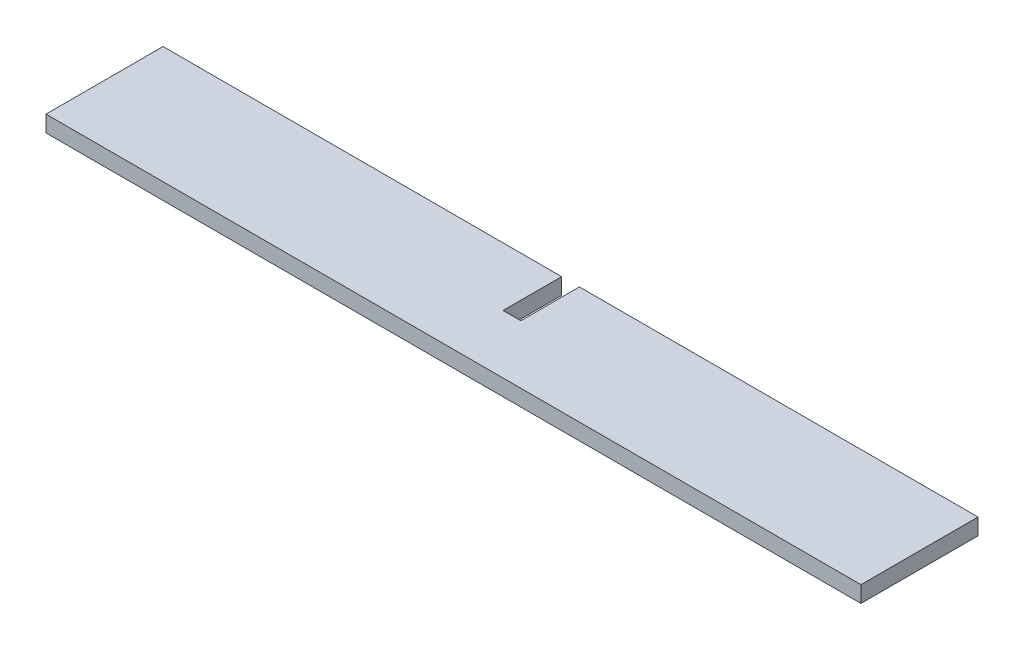
ISO-10303-21;
HEADER;
FILE_DESCRIPTION(('STEP AP214'),'2;1');
FILE_NAME('part.step','',(''),(''),'','','');
FILE_SCHEMA(('AUTOMOTIVE_DESIGN { 1 0 10303 214 1 1 1 1 }'));
ENDSEC;
DATA;
#1=APPLICATION_CONTEXT('core data for automotive mechanical design processes');
#2=APPLICATION_PROTOCOL_DEFINITION('international standard','automotive_design',2000,#1);
#3=PRODUCT_CONTEXT('',#1,'mechanical');
#4=PRODUCT('Part','Part','',(#3));
#5=PRODUCT_RELATED_PRODUCT_CATEGORY('part','',(#4));
#6=PRODUCT_DEFINITION_FORMATION('','',#4);
#7=PRODUCT_DEFINITION_CONTEXT('part definition',#1,'design');
#8=PRODUCT_DEFINITION('design','',#6,#7);
#9=PRODUCT_DEFINITION_SHAPE('','',#8);
#10=(LENGTH_UNIT() NAMED_UNIT(*) SI_UNIT(.MILLI.,.METRE.));
#11=(NAMED_UNIT(*) PLANE_ANGLE_UNIT() SI_UNIT($,.RADIAN.));
#12=(NAMED_UNIT(*) SI_UNIT($,.STERADIAN.) SOLID_ANGLE_UNIT());
#13=UNCERTAINTY_MEASURE_WITH_UNIT(LENGTH_MEASURE(1.E-05),#10,'distance_accuracy_value','');
#14=(GEOMETRIC_REPRESENTATION_CONTEXT(3) GLOBAL_UNCERTAINTY_ASSIGNED_CONTEXT((#13)) GLOBAL_UNIT_ASSIGNED_CONTEXT((#10,
#11,#12)) REPRESENTATION_CONTEXT('',''));
#15=CARTESIAN_POINT('',(0.,0.,0.));
#16=DIRECTION('',(0.,0.,1.));
#17=DIRECTION('',(1.,0.,0.));
#18=AXIS2_PLACEMENT_3D('',#15,#16,#17);
#19=CARTESIAN_POINT('',(0.,2.2,-9.50228728433344));
#20=DIRECTION('',(0.,0.,-1.));
#21=DIRECTION('',(-1.,0.,0.));
#22=AXIS2_PLACEMENT_3D('',#19,#20,#21);
#23=PLANE('',#22);
#24=DIRECTION('',(1.,0.,0.));
#25=VECTOR('',#24,1.);
#26=CARTESIAN_POINT('',(0.,0.,-9.50228728433344));
#27=LINE('',#26,#25);
#28=CARTESIAN_POINT('',(-12.2292983687423,0.,-9.50228728433344));
#29=VERTEX_POINT('',#28);
#30=CARTESIAN_POINT('',(-9.82929836874231,0.,-9.50228728433344));
#31=VERTEX_POINT('',#30);
#32=EDGE_CURVE('E129',#29,#31,#27,.T.);
#33=ORIENTED_EDGE('',*,*,#32,.F.);
#34=DIRECTION('',(0.,-1.,0.));
#35=VECTOR('',#34,1.);
#36=CARTESIAN_POINT('',(-12.2292983687423,2.2,-9.50228728433344));
#37=LINE('',#36,#35);
#38=CARTESIAN_POINT('',(-12.2292983687423,2.2,-9.50228728433344));
#39=VERTEX_POINT('',#38);
#40=EDGE_CURVE('E11',#39,#29,#37,.T.);
#41=ORIENTED_EDGE('',*,*,#40,.F.);
#42=DIRECTION('',(1.,0.,0.));
#43=VECTOR('',#42,1.);
#44=CARTESIAN_POINT('',(0.,2.2,-9.50228728433344));
#45=LINE('',#44,#43);
#46=CARTESIAN_POINT('',(-9.82929836874231,2.2,-9.50228728433344));
#47=VERTEX_POINT('',#46);
#48=EDGE_CURVE('E148',#39,#47,#45,.T.);
#49=ORIENTED_EDGE('',*,*,#48,.T.);
#50=DIRECTION('',(0.,-1.,0.));
#51=VECTOR('',#50,1.);
#52=CARTESIAN_POINT('',(-9.82929836874231,2.2,-9.50228728433344));
#53=LINE('',#52,#51);
#54=EDGE_CURVE('E87',#47,#31,#53,.T.);
#55=ORIENTED_EDGE('',*,*,#54,.T.);
#56=EDGE_LOOP('',(#33,#41,#49,#55));
#57=FACE_BOUND('',#56,.T.);
#58=ADVANCED_FACE('F37',(#57),#23,.T.);
#59=CARTESIAN_POINT('',(-12.2292983687423,2.2,0.));
#60=DIRECTION('',(1.,0.,0.));
#61=DIRECTION('',(0.,0.,-1.));
#62=AXIS2_PLACEMENT_3D('',#59,#60,#61);
#63=PLANE('',#62);
#64=DIRECTION('',(0.,0.,1.));
#65=VECTOR('',#64,1.);
#66=CARTESIAN_POINT('',(-12.2292983687423,0.,0.));
#67=LINE('',#66,#65);
#68=CARTESIAN_POINT('',(-12.2292983687423,0.,-17.4022872843335));
#69=VERTEX_POINT('',#68);
#70=EDGE_CURVE('E132',#69,#29,#67,.T.);
#71=ORIENTED_EDGE('',*,*,#70,.F.);
#72=DIRECTION('',(0.,-1.,0.));
#73=VECTOR('',#72,1.);
#74=CARTESIAN_POINT('',(-12.2292983687423,2.2,-17.4022872843335));
#75=LINE('',#74,#73);
#76=CARTESIAN_POINT('',(-12.2292983687423,2.2,-17.4022872843335));
#77=VERTEX_POINT('',#76);
#78=EDGE_CURVE('E45',#77,#69,#75,.T.);
#79=ORIENTED_EDGE('',*,*,#78,.F.);
#80=DIRECTION('',(0.,0.,1.));
#81=VECTOR('',#80,1.);
#82=CARTESIAN_POINT('',(-12.2292983687423,2.2,0.));
#83=LINE('',#82,#81);
#84=EDGE_CURVE('E181',#77,#39,#83,.T.);
#85=ORIENTED_EDGE('',*,*,#84,.T.);
#86=ORIENTED_EDGE('',*,*,#40,.T.);
#87=EDGE_LOOP('',(#71,#79,#85,#86));
#88=FACE_BOUND('',#87,.T.);
#89=ADVANCED_FACE('F166',(#88),#63,.T.);
#90=CARTESIAN_POINT('',(0.,2.2,-17.4022872843335));
#91=DIRECTION('',(0.,0.,-1.));
#92=DIRECTION('',(-1.,0.,0.));
#93=AXIS2_PLACEMENT_3D('',#90,#91,#92);
#94=PLANE('',#93);
#95=DIRECTION('',(1.,0.,0.));
#96=VECTOR('',#95,1.);
#97=CARTESIAN_POINT('',(0.,0.,-17.4022872843335));
#98=LINE('',#97,#96);
#99=CARTESIAN_POINT('',(-66.0292983687423,0.,-17.4022872843335));
#100=VERTEX_POINT('',#99);
#101=EDGE_CURVE('E135',#100,#69,#98,.T.);
#102=ORIENTED_EDGE('',*,*,#101,.F.);
#103=DIRECTION('',(0.,-1.,0.));
#104=VECTOR('',#103,1.);
#105=CARTESIAN_POINT('',(-66.0292983687423,2.2,-17.4022872843335));
#106=LINE('',#105,#104);
#107=CARTESIAN_POINT('',(-66.0292983687423,2.2,-17.4022872843335));
#108=VERTEX_POINT('',#107);
#109=EDGE_CURVE('E155',#108,#100,#106,.T.);
#110=ORIENTED_EDGE('',*,*,#109,.F.);
#111=DIRECTION('',(1.,0.,0.));
#112=VECTOR('',#111,1.);
#113=CARTESIAN_POINT('',(0.,2.2,-17.4022872843335));
#114=LINE('',#113,#112);
#115=EDGE_CURVE('E162',#108,#77,#114,.T.);
#116=ORIENTED_EDGE('',*,*,#115,.T.);
#117=ORIENTED_EDGE('',*,*,#78,.T.);
#118=EDGE_LOOP('',(#102,#110,#116,#117));
#119=FACE_BOUND('',#118,.T.);
#120=ADVANCED_FACE('F160',(#119),#94,.T.);
#121=CARTESIAN_POINT('',(-66.0292983687423,2.2,0.));
#122=DIRECTION('',(1.,0.,0.));
#123=DIRECTION('',(0.,0.,-1.));
#124=AXIS2_PLACEMENT_3D('',#121,#122,#123);
#125=PLANE('',#124);
#126=DIRECTION('',(0.,0.,1.));
#127=VECTOR('',#126,1.);
#128=CARTESIAN_POINT('',(-66.0292983687423,0.,0.));
#129=LINE('',#128,#127);
#130=CARTESIAN_POINT('',(-66.0292983687423,0.,-1.60228728433345));
#131=VERTEX_POINT('',#130);
#132=EDGE_CURVE('E138',#100,#131,#129,.T.);
#133=ORIENTED_EDGE('',*,*,#132,.T.);
#134=DIRECTION('',(0.,-1.,0.));
#135=VECTOR('',#134,1.);
#136=CARTESIAN_POINT('',(-66.0292983687423,2.2,-1.60228728433345));
#137=LINE('',#136,#135);
#138=CARTESIAN_POINT('',(-66.0292983687423,2.2,-1.60228728433345));
#139=VERTEX_POINT('',#138);
#140=EDGE_CURVE('E152',#139,#131,#137,.T.);
#141=ORIENTED_EDGE('',*,*,#140,.F.);
#142=DIRECTION('',(0.,0.,1.));
#143=VECTOR('',#142,1.);
#144=CARTESIAN_POINT('',(-66.0292983687423,2.2,0.));
#145=LINE('',#144,#143);
#146=EDGE_CURVE('E177',#108,#139,#145,.T.);
#147=ORIENTED_EDGE('',*,*,#146,.F.);
#148=ORIENTED_EDGE('',*,*,#109,.T.);
#149=EDGE_LOOP('',(#133,#141,#147,#148));
#150=FACE_BOUND('',#149,.T.);
#151=ADVANCED_FACE('F173',(#150),#125,.F.);
#152=CARTESIAN_POINT('',(0.,2.2,-1.60228728433345));
#153=DIRECTION('',(0.,0.,-1.));
#154=DIRECTION('',(-1.,0.,0.));
#155=AXIS2_PLACEMENT_3D('',#152,#153,#154);
#156=PLANE('',#155);
#157=DIRECTION('',(1.,0.,0.));
#158=VECTOR('',#157,1.);
#159=CARTESIAN_POINT('',(0.,0.,-1.60228728433345));
#160=LINE('',#159,#158);
#161=CARTESIAN_POINT('',(43.9707016312577,0.,-1.60228728433345));
#162=VERTEX_POINT('',#161);
#163=EDGE_CURVE('E140',#131,#162,#160,.T.);
#164=ORIENTED_EDGE('',*,*,#163,.T.);
#165=DIRECTION('',(0.,-1.,0.));
#166=VECTOR('',#165,1.);
#167=CARTESIAN_POINT('',(43.9707016312577,2.2,-1.60228728433345));
#168=LINE('',#167,#166);
#169=CARTESIAN_POINT('',(43.9707016312577,2.2,-1.60228728433345));
#170=VERTEX_POINT('',#169);
#171=EDGE_CURVE('E116',#170,#162,#168,.T.);
#172=ORIENTED_EDGE('',*,*,#171,.F.);
#173=DIRECTION('',(1.,0.,0.));
#174=VECTOR('',#173,1.);
#175=CARTESIAN_POINT('',(0.,2.2,-1.60228728433345));
#176=LINE('',#175,#174);
#177=EDGE_CURVE('E121',#139,#170,#176,.T.);
#178=ORIENTED_EDGE('',*,*,#177,.F.);
#179=ORIENTED_EDGE('',*,*,#140,.T.);
#180=EDGE_LOOP('',(#164,#172,#178,#179));
#181=FACE_BOUND('',#180,.T.);
#182=ADVANCED_FACE('F176',(#181),#156,.F.);
#183=CARTESIAN_POINT('',(43.9707016312577,2.2,0.));
#184=DIRECTION('',(1.,0.,0.));
#185=DIRECTION('',(0.,0.,-1.));
#186=AXIS2_PLACEMENT_3D('',#183,#184,#185);
#187=PLANE('',#186);
#188=DIRECTION('',(0.,0.,1.));
#189=VECTOR('',#188,1.);
#190=CARTESIAN_POINT('',(43.9707016312577,0.,0.));
#191=LINE('',#190,#189);
#192=CARTESIAN_POINT('',(43.9707016312577,0.,-17.4022872843335));
#193=VERTEX_POINT('',#192);
#194=EDGE_CURVE('E111',#193,#162,#191,.T.);
#195=ORIENTED_EDGE('',*,*,#194,.F.);
#196=DIRECTION('',(0.,-1.,0.));
#197=VECTOR('',#196,1.);
#198=CARTESIAN_POINT('',(43.9707016312577,2.2,-17.4022872843335));
#199=LINE('',#198,#197);
#200=CARTESIAN_POINT('',(43.9707016312577,2.2,-17.4022872843335));
#201=VERTEX_POINT('',#200);
#202=EDGE_CURVE('E106',#201,#193,#199,.T.);
#203=ORIENTED_EDGE('',*,*,#202,.F.);
#204=DIRECTION('',(0.,0.,1.));
#205=VECTOR('',#204,1.);
#206=CARTESIAN_POINT('',(43.9707016312577,2.2,0.));
#207=LINE('',#206,#205);
#208=EDGE_CURVE('E109',#201,#170,#207,.T.);
#209=ORIENTED_EDGE('',*,*,#208,.T.);
#210=ORIENTED_EDGE('',*,*,#171,.T.);
#211=EDGE_LOOP('',(#195,#203,#209,#210));
#212=FACE_BOUND('',#211,.T.);
#213=ADVANCED_FACE('F108',(#212),#187,.T.);
#214=CARTESIAN_POINT('',(0.,2.2,-17.4022872843335));
#215=DIRECTION('',(0.,0.,-1.));
#216=DIRECTION('',(-1.,0.,0.));
#217=AXIS2_PLACEMENT_3D('',#214,#215,#216);
#218=PLANE('',#217);
#219=DIRECTION('',(1.,0.,0.));
#220=VECTOR('',#219,1.);
#221=CARTESIAN_POINT('',(0.,0.,-17.4022872843335));
#222=LINE('',#221,#220);
#223=CARTESIAN_POINT('',(-9.82929836874231,0.,-17.4022872843335));
#224=VERTEX_POINT('',#223);
#225=EDGE_CURVE('E144',#224,#193,#222,.T.);
#226=ORIENTED_EDGE('',*,*,#225,.F.);
#227=DIRECTION('',(0.,-1.,0.));
#228=VECTOR('',#227,1.);
#229=CARTESIAN_POINT('',(-9.82929836874231,2.2,-17.4022872843335));
#230=LINE('',#229,#228);
#231=CARTESIAN_POINT('',(-9.82929836874231,2.2,-17.4022872843335));
#232=VERTEX_POINT('',#231);
#233=EDGE_CURVE('E80',#232,#224,#230,.T.);
#234=ORIENTED_EDGE('',*,*,#233,.F.);
#235=DIRECTION('',(1.,0.,0.));
#236=VECTOR('',#235,1.);
#237=CARTESIAN_POINT('',(0.,2.2,-17.4022872843335));
#238=LINE('',#237,#236);
#239=EDGE_CURVE('E119',#232,#201,#238,.T.);
#240=ORIENTED_EDGE('',*,*,#239,.T.);
#241=ORIENTED_EDGE('',*,*,#202,.T.);
#242=EDGE_LOOP('',(#226,#234,#240,#241));
#243=FACE_BOUND('',#242,.T.);
#244=ADVANCED_FACE('F124',(#243),#218,.T.);
#245=CARTESIAN_POINT('',(-9.82929836874231,2.2,0.));
#246=DIRECTION('',(1.,0.,0.));
#247=DIRECTION('',(0.,0.,-1.));
#248=AXIS2_PLACEMENT_3D('',#245,#246,#247);
#249=PLANE('',#248);
#250=DIRECTION('',(0.,0.,1.));
#251=VECTOR('',#250,1.);
#252=CARTESIAN_POINT('',(-9.82929836874231,0.,0.));
#253=LINE('',#252,#251);
#254=EDGE_CURVE('E146',#224,#31,#253,.T.);
#255=ORIENTED_EDGE('',*,*,#254,.T.);
#256=ORIENTED_EDGE('',*,*,#54,.F.);
#257=DIRECTION('',(0.,0.,1.));
#258=VECTOR('',#257,1.);
#259=CARTESIAN_POINT('',(-9.82929836874231,2.2,0.));
#260=LINE('',#259,#258);
#261=EDGE_CURVE('E53',#232,#47,#260,.T.);
#262=ORIENTED_EDGE('',*,*,#261,.F.);
#263=ORIENTED_EDGE('',*,*,#233,.T.);
#264=EDGE_LOOP('',(#255,#256,#262,#263));
#265=FACE_BOUND('',#264,.T.);
#266=ADVANCED_FACE('F200',(#265),#249,.F.);
#267=CARTESIAN_POINT('',(0.,2.2,0.));
#268=DIRECTION('',(0.,1.,0.));
#269=DIRECTION('',(0.,0.,1.));
#270=AXIS2_PLACEMENT_3D('',#267,#268,#269);
#271=PLANE('',#270);
#272=ORIENTED_EDGE('',*,*,#48,.F.);
#273=ORIENTED_EDGE('',*,*,#84,.F.);
#274=ORIENTED_EDGE('',*,*,#115,.F.);
#275=ORIENTED_EDGE('',*,*,#146,.T.);
#276=ORIENTED_EDGE('',*,*,#177,.T.);
#277=ORIENTED_EDGE('',*,*,#208,.F.);
#278=ORIENTED_EDGE('',*,*,#239,.F.);
#279=ORIENTED_EDGE('',*,*,#261,.T.);
#280=EDGE_LOOP('',(#272,#273,#274,#275,#276,#277,#278,#279));
#281=FACE_BOUND('',#280,.T.);
#282=ADVANCED_FACE('F118',(#281),#271,.T.);
#283=CARTESIAN_POINT('',(0.,0.,0.));
#284=DIRECTION('',(0.,1.,0.));
#285=DIRECTION('',(0.,0.,1.));
#286=AXIS2_PLACEMENT_3D('',#283,#284,#285);
#287=PLANE('',#286);
#288=ORIENTED_EDGE('',*,*,#32,.T.);
#289=ORIENTED_EDGE('',*,*,#254,.F.);
#290=ORIENTED_EDGE('',*,*,#225,.T.);
#291=ORIENTED_EDGE('',*,*,#194,.T.);
#292=ORIENTED_EDGE('',*,*,#163,.F.);
#293=ORIENTED_EDGE('',*,*,#132,.F.);
#294=ORIENTED_EDGE('',*,*,#101,.T.);
#295=ORIENTED_EDGE('',*,*,#70,.T.);
#296=EDGE_LOOP('',(#288,#289,#290,#291,#292,#293,#294,#295));
#297=FACE_BOUND('',#296,.T.);
#298=ADVANCED_FACE('F169',(#297),#287,.F.);
#299=CLOSED_SHELL('',(#58,#89,#120,#151,#182,#213,#244,#266,#282,#298));
#300=MANIFOLD_SOLID_BREP('B2',#299);
#301=ADVANCED_BREP_SHAPE_REPRESENTATION('',(#18,#300),#14);
#302=SHAPE_DEFINITION_REPRESENTATION(#9,#301);
ENDSEC;
END-ISO-10303-21;
